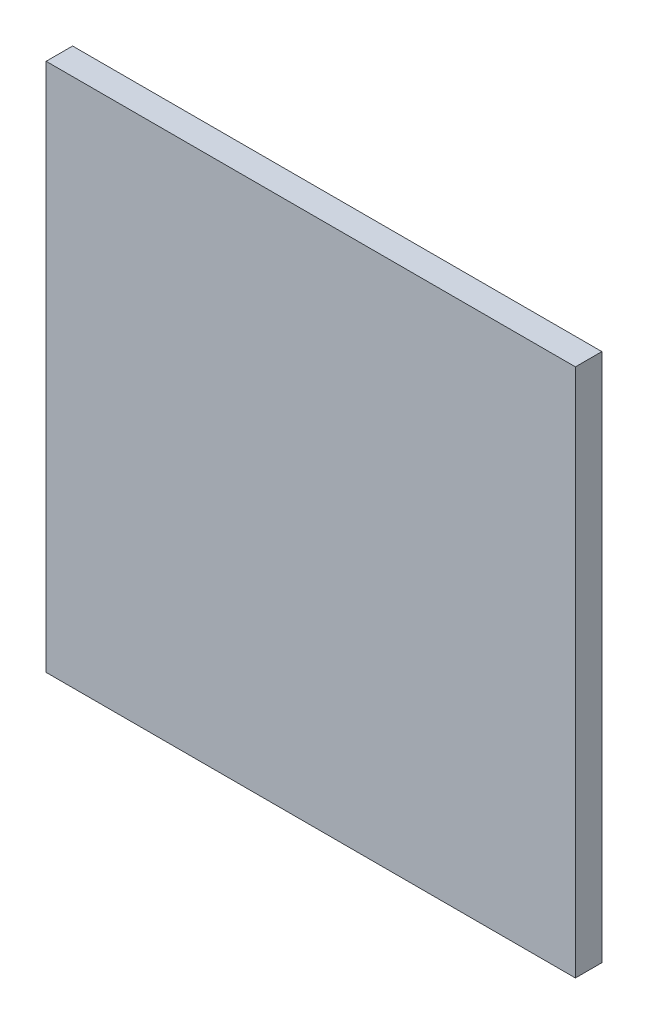
ISO-10303-21;
HEADER;
FILE_DESCRIPTION(('STEP AP214'),'2;1');
FILE_NAME('part.step','',(''),(''),'','','');
FILE_SCHEMA(('AUTOMOTIVE_DESIGN { 1 0 10303 214 1 1 1 1 }'));
ENDSEC;
DATA;
#1=APPLICATION_CONTEXT('core data for automotive mechanical design processes');
#2=APPLICATION_PROTOCOL_DEFINITION('international standard','automotive_design',2000,#1);
#3=PRODUCT_CONTEXT('',#1,'mechanical');
#4=PRODUCT('Part','Part','',(#3));
#5=PRODUCT_RELATED_PRODUCT_CATEGORY('part','',(#4));
#6=PRODUCT_DEFINITION_FORMATION('','',#4);
#7=PRODUCT_DEFINITION_CONTEXT('part definition',#1,'design');
#8=PRODUCT_DEFINITION('design','',#6,#7);
#9=PRODUCT_DEFINITION_SHAPE('','',#8);
#10=(LENGTH_UNIT() NAMED_UNIT(*) SI_UNIT(.MILLI.,.METRE.));
#11=(NAMED_UNIT(*) PLANE_ANGLE_UNIT() SI_UNIT($,.RADIAN.));
#12=(NAMED_UNIT(*) SI_UNIT($,.STERADIAN.) SOLID_ANGLE_UNIT());
#13=UNCERTAINTY_MEASURE_WITH_UNIT(LENGTH_MEASURE(1.E-05),#10,'distance_accuracy_value','');
#14=(GEOMETRIC_REPRESENTATION_CONTEXT(3) GLOBAL_UNCERTAINTY_ASSIGNED_CONTEXT((#13)) GLOBAL_UNIT_ASSIGNED_CONTEXT((#10,
#11,#12)) REPRESENTATION_CONTEXT('',''));
#15=CARTESIAN_POINT('',(0.,0.,0.));
#16=DIRECTION('',(0.,0.,1.));
#17=DIRECTION('',(1.,0.,0.));
#18=AXIS2_PLACEMENT_3D('',#15,#16,#17);
#19=CARTESIAN_POINT('',(0.,0.,5.));
#20=DIRECTION('',(-1.,0.,0.));
#21=DIRECTION('',(0.,-1.,0.));
#22=AXIS2_PLACEMENT_3D('',#19,#20,#21);
#23=PLANE('',#22);
#24=DIRECTION('',(0.,1.,0.));
#25=VECTOR('',#24,1.);
#26=CARTESIAN_POINT('',(0.,0.,0.));
#27=LINE('',#26,#25);
#28=CARTESIAN_POINT('',(0.,-100.,0.));
#29=VERTEX_POINT('',#28);
#30=CARTESIAN_POINT('',(0.,0.,0.));
#31=VERTEX_POINT('',#30);
#32=EDGE_CURVE('E107',#29,#31,#27,.T.);
#33=ORIENTED_EDGE('',*,*,#32,.T.);
#34=DIRECTION('',(0.,0.,-1.));
#35=VECTOR('',#34,1.);
#36=CARTESIAN_POINT('',(0.,0.,5.));
#37=LINE('',#36,#35);
#38=CARTESIAN_POINT('',(0.,0.,5.));
#39=VERTEX_POINT('',#38);
#40=EDGE_CURVE('E11',#39,#31,#37,.T.);
#41=ORIENTED_EDGE('',*,*,#40,.F.);
#42=DIRECTION('',(0.,1.,0.));
#43=VECTOR('',#42,1.);
#44=CARTESIAN_POINT('',(0.,0.,5.));
#45=LINE('',#44,#43);
#46=CARTESIAN_POINT('',(0.,-100.,5.));
#47=VERTEX_POINT('',#46);
#48=EDGE_CURVE('E91',#47,#39,#45,.T.);
#49=ORIENTED_EDGE('',*,*,#48,.F.);
#50=DIRECTION('',(0.,0.,-1.));
#51=VECTOR('',#50,1.);
#52=CARTESIAN_POINT('',(0.,-100.,5.));
#53=LINE('',#52,#51);
#54=EDGE_CURVE('E103',#47,#29,#53,.T.);
#55=ORIENTED_EDGE('',*,*,#54,.T.);
#56=EDGE_LOOP('',(#33,#41,#49,#55));
#57=FACE_BOUND('',#56,.T.);
#58=ADVANCED_FACE('F39',(#57),#23,.F.);
#59=CARTESIAN_POINT('',(0.,0.,5.));
#60=DIRECTION('',(0.,-1.,0.));
#61=DIRECTION('',(1.,0.,0.));
#62=AXIS2_PLACEMENT_3D('',#59,#60,#61);
#63=PLANE('',#62);
#64=DIRECTION('',(-1.,0.,0.));
#65=VECTOR('',#64,1.);
#66=CARTESIAN_POINT('',(0.,0.,0.));
#67=LINE('',#66,#65);
#68=CARTESIAN_POINT('',(-100.,0.,0.));
#69=VERTEX_POINT('',#68);
#70=EDGE_CURVE('E96',#31,#69,#67,.T.);
#71=ORIENTED_EDGE('',*,*,#70,.T.);
#72=DIRECTION('',(0.,0.,-1.));
#73=VECTOR('',#72,1.);
#74=CARTESIAN_POINT('',(-100.,0.,5.));
#75=LINE('',#74,#73);
#76=CARTESIAN_POINT('',(-100.,0.,5.));
#77=VERTEX_POINT('',#76);
#78=EDGE_CURVE('E48',#77,#69,#75,.T.);
#79=ORIENTED_EDGE('',*,*,#78,.F.);
#80=DIRECTION('',(-1.,0.,0.));
#81=VECTOR('',#80,1.);
#82=CARTESIAN_POINT('',(0.,0.,5.));
#83=LINE('',#82,#81);
#84=EDGE_CURVE('E86',#39,#77,#83,.T.);
#85=ORIENTED_EDGE('',*,*,#84,.F.);
#86=ORIENTED_EDGE('',*,*,#40,.T.);
#87=EDGE_LOOP('',(#71,#79,#85,#86));
#88=FACE_BOUND('',#87,.T.);
#89=ADVANCED_FACE('F95',(#88),#63,.F.);
#90=CARTESIAN_POINT('',(-100.,0.,5.));
#91=DIRECTION('',(1.,0.,0.));
#92=DIRECTION('',(0.,0.,-1.));
#93=AXIS2_PLACEMENT_3D('',#90,#91,#92);
#94=PLANE('',#93);
#95=DIRECTION('',(0.,-1.,0.));
#96=VECTOR('',#95,1.);
#97=CARTESIAN_POINT('',(-100.,0.,0.));
#98=LINE('',#97,#96);
#99=CARTESIAN_POINT('',(-100.,-100.,0.));
#100=VERTEX_POINT('',#99);
#101=EDGE_CURVE('E73',#69,#100,#98,.T.);
#102=ORIENTED_EDGE('',*,*,#101,.T.);
#103=DIRECTION('',(0.,0.,-1.));
#104=VECTOR('',#103,1.);
#105=CARTESIAN_POINT('',(-100.,-100.,5.));
#106=LINE('',#105,#104);
#107=CARTESIAN_POINT('',(-100.,-100.,5.));
#108=VERTEX_POINT('',#107);
#109=EDGE_CURVE('E98',#108,#100,#106,.T.);
#110=ORIENTED_EDGE('',*,*,#109,.F.);
#111=DIRECTION('',(0.,-1.,0.));
#112=VECTOR('',#111,1.);
#113=CARTESIAN_POINT('',(-100.,0.,5.));
#114=LINE('',#113,#112);
#115=EDGE_CURVE('E89',#77,#108,#114,.T.);
#116=ORIENTED_EDGE('',*,*,#115,.F.);
#117=ORIENTED_EDGE('',*,*,#78,.T.);
#118=EDGE_LOOP('',(#102,#110,#116,#117));
#119=FACE_BOUND('',#118,.T.);
#120=ADVANCED_FACE('F99',(#119),#94,.F.);
#121=CARTESIAN_POINT('',(0.,-100.,5.));
#122=DIRECTION('',(0.,1.,0.));
#123=DIRECTION('',(0.,0.,1.));
#124=AXIS2_PLACEMENT_3D('',#121,#122,#123);
#125=PLANE('',#124);
#126=DIRECTION('',(1.,0.,0.));
#127=VECTOR('',#126,1.);
#128=CARTESIAN_POINT('',(0.,-100.,0.));
#129=LINE('',#128,#127);
#130=EDGE_CURVE('E79',#100,#29,#129,.T.);
#131=ORIENTED_EDGE('',*,*,#130,.T.);
#132=ORIENTED_EDGE('',*,*,#54,.F.);
#133=DIRECTION('',(1.,0.,0.));
#134=VECTOR('',#133,1.);
#135=CARTESIAN_POINT('',(0.,-100.,5.));
#136=LINE('',#135,#134);
#137=EDGE_CURVE('E56',#108,#47,#136,.T.);
#138=ORIENTED_EDGE('',*,*,#137,.F.);
#139=ORIENTED_EDGE('',*,*,#109,.T.);
#140=EDGE_LOOP('',(#131,#132,#138,#139));
#141=FACE_BOUND('',#140,.T.);
#142=ADVANCED_FACE('F120',(#141),#125,.F.);
#143=CARTESIAN_POINT('',(0.,0.,5.));
#144=DIRECTION('',(0.,0.,-1.));
#145=DIRECTION('',(-1.,0.,0.));
#146=AXIS2_PLACEMENT_3D('',#143,#144,#145);
#147=PLANE('',#146);
#148=ORIENTED_EDGE('',*,*,#48,.T.);
#149=ORIENTED_EDGE('',*,*,#84,.T.);
#150=ORIENTED_EDGE('',*,*,#115,.T.);
#151=ORIENTED_EDGE('',*,*,#137,.T.);
#152=EDGE_LOOP('',(#148,#149,#150,#151));
#153=FACE_BOUND('',#152,.T.);
#154=ADVANCED_FACE('F87',(#153),#147,.F.);
#155=CARTESIAN_POINT('',(0.,0.,0.));
#156=DIRECTION('',(0.,0.,-1.));
#157=DIRECTION('',(-1.,0.,0.));
#158=AXIS2_PLACEMENT_3D('',#155,#156,#157);
#159=PLANE('',#158);
#160=ORIENTED_EDGE('',*,*,#32,.F.);
#161=ORIENTED_EDGE('',*,*,#130,.F.);
#162=ORIENTED_EDGE('',*,*,#101,.F.);
#163=ORIENTED_EDGE('',*,*,#70,.F.);
#164=EDGE_LOOP('',(#160,#161,#162,#163));
#165=FACE_BOUND('',#164,.T.);
#166=ADVANCED_FACE('F123',(#165),#159,.T.);
#167=CLOSED_SHELL('',(#58,#89,#120,#142,#154,#166));
#168=MANIFOLD_SOLID_BREP('B2',#167);
#169=ADVANCED_BREP_SHAPE_REPRESENTATION('',(#18,#168),#14);
#170=SHAPE_DEFINITION_REPRESENTATION(#9,#169);
ENDSEC;
END-ISO-10303-21;
